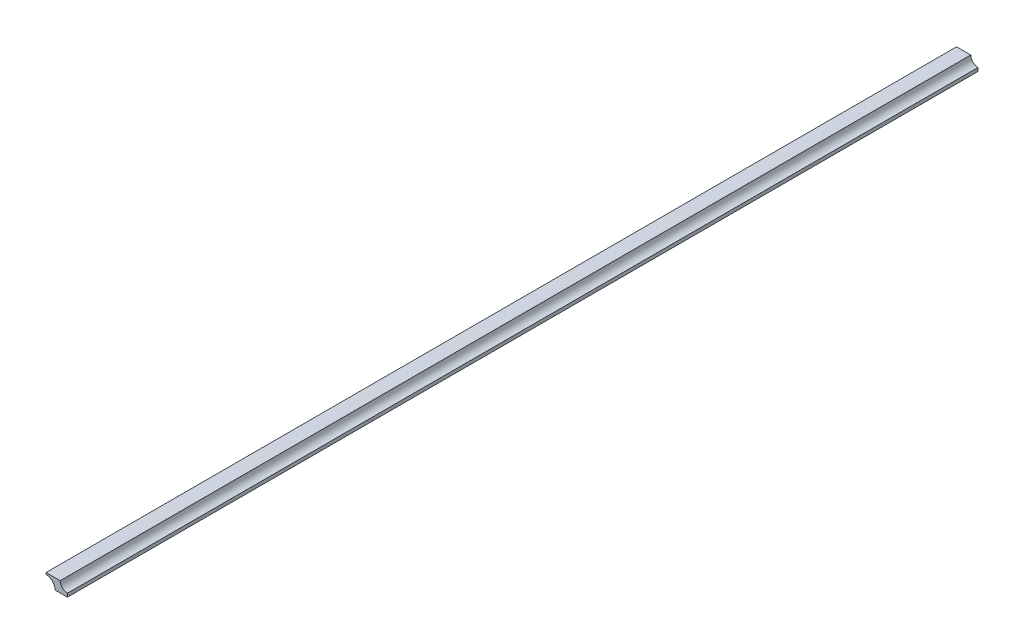
ISO-10303-21;
HEADER;
FILE_DESCRIPTION(('STEP AP214'),'2;1');
FILE_NAME('part.step','',(''),(''),'','','');
FILE_SCHEMA(('AUTOMOTIVE_DESIGN { 1 0 10303 214 1 1 1 1 }'));
ENDSEC;
DATA;
#1=APPLICATION_CONTEXT('core data for automotive mechanical design processes');
#2=APPLICATION_PROTOCOL_DEFINITION('international standard','automotive_design',2000,#1);
#3=PRODUCT_CONTEXT('',#1,'mechanical');
#4=PRODUCT('Part','Part','',(#3));
#5=PRODUCT_RELATED_PRODUCT_CATEGORY('part','',(#4));
#6=PRODUCT_DEFINITION_FORMATION('','',#4);
#7=PRODUCT_DEFINITION_CONTEXT('part definition',#1,'design');
#8=PRODUCT_DEFINITION('design','',#6,#7);
#9=PRODUCT_DEFINITION_SHAPE('','',#8);
#10=(LENGTH_UNIT() NAMED_UNIT(*) SI_UNIT(.MILLI.,.METRE.));
#11=(NAMED_UNIT(*) PLANE_ANGLE_UNIT() SI_UNIT($,.RADIAN.));
#12=(NAMED_UNIT(*) SI_UNIT($,.STERADIAN.) SOLID_ANGLE_UNIT());
#13=UNCERTAINTY_MEASURE_WITH_UNIT(LENGTH_MEASURE(1.E-05),#10,'distance_accuracy_value','');
#14=(GEOMETRIC_REPRESENTATION_CONTEXT(3) GLOBAL_UNCERTAINTY_ASSIGNED_CONTEXT((#13)) GLOBAL_UNIT_ASSIGNED_CONTEXT((#10,
#11,#12)) REPRESENTATION_CONTEXT('',''));
#15=CARTESIAN_POINT('',(0.,0.,0.));
#16=DIRECTION('',(0.,0.,1.));
#17=DIRECTION('',(1.,0.,0.));
#18=AXIS2_PLACEMENT_3D('',#15,#16,#17);
#19=CARTESIAN_POINT('',(0.,9.4,800.));
#20=DIRECTION('',(0.,-1.,0.));
#21=DIRECTION('',(0.,0.,-1.));
#22=AXIS2_PLACEMENT_3D('',#19,#20,#21);
#23=PLANE('',#22);
#24=DIRECTION('',(-1.,0.,0.));
#25=VECTOR('',#24,1.);
#26=CARTESIAN_POINT('',(0.,9.4,0.));
#27=LINE('',#26,#25);
#28=CARTESIAN_POINT('',(12.45,9.4,0.));
#29=VERTEX_POINT('',#28);
#30=CARTESIAN_POINT('',(0.,9.4,0.));
#31=VERTEX_POINT('',#30);
#32=EDGE_CURVE('E134',#29,#31,#27,.T.);
#33=ORIENTED_EDGE('',*,*,#32,.T.);
#34=DIRECTION('',(0.,0.,-1.));
#35=VECTOR('',#34,1.);
#36=CARTESIAN_POINT('',(0.,9.4,800.));
#37=LINE('',#36,#35);
#38=CARTESIAN_POINT('',(0.,9.4,800.));
#39=VERTEX_POINT('',#38);
#40=EDGE_CURVE('E11',#39,#31,#37,.T.);
#41=ORIENTED_EDGE('',*,*,#40,.F.);
#42=DIRECTION('',(-1.,0.,0.));
#43=VECTOR('',#42,1.);
#44=CARTESIAN_POINT('',(0.,9.4,800.));
#45=LINE('',#44,#43);
#46=CARTESIAN_POINT('',(12.45,9.4,800.));
#47=VERTEX_POINT('',#46);
#48=EDGE_CURVE('E150',#47,#39,#45,.T.);
#49=ORIENTED_EDGE('',*,*,#48,.F.);
#50=DIRECTION('',(0.,0.,-1.));
#51=VECTOR('',#50,1.);
#52=CARTESIAN_POINT('',(12.45,9.4,800.));
#53=LINE('',#52,#51);
#54=EDGE_CURVE('E130',#47,#29,#53,.T.);
#55=ORIENTED_EDGE('',*,*,#54,.T.);
#56=EDGE_LOOP('',(#33,#41,#49,#55));
#57=FACE_BOUND('',#56,.T.);
#58=ADVANCED_FACE('F45',(#57),#23,.F.);
#59=CARTESIAN_POINT('',(0.,7.94,800.));
#60=DIRECTION('',(1.,0.,0.));
#61=DIRECTION('',(0.,0.,-1.));
#62=AXIS2_PLACEMENT_3D('',#59,#60,#61);
#63=PLANE('',#62);
#64=DIRECTION('',(0.,-1.,0.));
#65=VECTOR('',#64,1.);
#66=CARTESIAN_POINT('',(0.,7.94,0.));
#67=LINE('',#66,#65);
#68=CARTESIAN_POINT('',(0.,7.94,0.));
#69=VERTEX_POINT('',#68);
#70=EDGE_CURVE('E138',#31,#69,#67,.T.);
#71=ORIENTED_EDGE('',*,*,#70,.T.);
#72=DIRECTION('',(0.,0.,-1.));
#73=VECTOR('',#72,1.);
#74=CARTESIAN_POINT('',(0.,7.94,800.));
#75=LINE('',#74,#73);
#76=CARTESIAN_POINT('',(0.,7.94,800.));
#77=VERTEX_POINT('',#76);
#78=EDGE_CURVE('E54',#77,#69,#75,.T.);
#79=ORIENTED_EDGE('',*,*,#78,.F.);
#80=DIRECTION('',(0.,-1.,0.));
#81=VECTOR('',#80,1.);
#82=CARTESIAN_POINT('',(0.,7.94,800.));
#83=LINE('',#82,#81);
#84=EDGE_CURVE('E99',#39,#77,#83,.T.);
#85=ORIENTED_EDGE('',*,*,#84,.F.);
#86=ORIENTED_EDGE('',*,*,#40,.T.);
#87=EDGE_LOOP('',(#71,#79,#85,#86));
#88=FACE_BOUND('',#87,.T.);
#89=ADVANCED_FACE('F178',(#88),#63,.F.);
#90=CARTESIAN_POINT('',(0.,0.,800.));
#91=DIRECTION('',(0.,0.,-1.));
#92=DIRECTION('',(-1.,0.,0.));
#93=AXIS2_PLACEMENT_3D('',#90,#91,#92);
#94=CYLINDRICAL_SURFACE('',#93,7.94);
#95=CARTESIAN_POINT('',(0.,0.,0.));
#96=DIRECTION('',(0.,0.,-1.));
#97=DIRECTION('',(1.,0.,0.));
#98=AXIS2_PLACEMENT_3D('',#95,#96,#97);
#99=CIRCLE('',#98,7.94);
#100=CARTESIAN_POINT('',(7.94,0.,0.));
#101=VERTEX_POINT('',#100);
#102=EDGE_CURVE('E141',#69,#101,#99,.T.);
#103=ORIENTED_EDGE('',*,*,#102,.T.);
#104=DIRECTION('',(0.,0.,-1.));
#105=VECTOR('',#104,1.);
#106=CARTESIAN_POINT('',(7.94,0.,800.));
#107=LINE('',#106,#105);
#108=CARTESIAN_POINT('',(7.94,0.,800.));
#109=VERTEX_POINT('',#108);
#110=EDGE_CURVE('E123',#109,#101,#107,.T.);
#111=ORIENTED_EDGE('',*,*,#110,.F.);
#112=CARTESIAN_POINT('',(0.,0.,800.));
#113=DIRECTION('',(0.,0.,-1.));
#114=DIRECTION('',(1.,0.,0.));
#115=AXIS2_PLACEMENT_3D('',#112,#113,#114);
#116=CIRCLE('',#115,7.94);
#117=EDGE_CURVE('E112',#77,#109,#116,.T.);
#118=ORIENTED_EDGE('',*,*,#117,.F.);
#119=ORIENTED_EDGE('',*,*,#78,.T.);
#120=EDGE_LOOP('',(#103,#111,#118,#119));
#121=FACE_BOUND('',#120,.T.);
#122=ADVANCED_FACE('F160',(#121),#94,.F.);
#123=CARTESIAN_POINT('',(7.94,0.,800.));
#124=DIRECTION('',(0.,1.,0.));
#125=DIRECTION('',(0.,0.,1.));
#126=AXIS2_PLACEMENT_3D('',#123,#124,#125);
#127=PLANE('',#126);
#128=DIRECTION('',(1.,0.,0.));
#129=VECTOR('',#128,1.);
#130=CARTESIAN_POINT('',(7.94,0.,0.));
#131=LINE('',#130,#129);
#132=CARTESIAN_POINT('',(18.8,0.,0.));
#133=VERTEX_POINT('',#132);
#134=EDGE_CURVE('E121',#101,#133,#131,.T.);
#135=ORIENTED_EDGE('',*,*,#134,.T.);
#136=DIRECTION('',(0.,0.,-1.));
#137=VECTOR('',#136,1.);
#138=CARTESIAN_POINT('',(18.8,0.,800.));
#139=LINE('',#138,#137);
#140=CARTESIAN_POINT('',(18.8,0.,800.));
#141=VERTEX_POINT('',#140);
#142=EDGE_CURVE('E118',#141,#133,#139,.T.);
#143=ORIENTED_EDGE('',*,*,#142,.F.);
#144=DIRECTION('',(1.,0.,0.));
#145=VECTOR('',#144,1.);
#146=CARTESIAN_POINT('',(7.94,0.,800.));
#147=LINE('',#146,#145);
#148=EDGE_CURVE('E106',#109,#141,#147,.T.);
#149=ORIENTED_EDGE('',*,*,#148,.F.);
#150=ORIENTED_EDGE('',*,*,#110,.T.);
#151=EDGE_LOOP('',(#135,#143,#149,#150));
#152=FACE_BOUND('',#151,.T.);
#153=ADVANCED_FACE('F119',(#152),#127,.F.);
#154=CARTESIAN_POINT('',(18.8,0.,800.));
#155=DIRECTION('',(-1.,0.,0.));
#156=DIRECTION('',(0.,0.,1.));
#157=AXIS2_PLACEMENT_3D('',#154,#155,#156);
#158=PLANE('',#157);
#159=DIRECTION('',(0.,1.,0.));
#160=VECTOR('',#159,1.);
#161=CARTESIAN_POINT('',(18.8,0.,0.));
#162=LINE('',#161,#160);
#163=CARTESIAN_POINT('',(18.8,3.05,0.));
#164=VERTEX_POINT('',#163);
#165=EDGE_CURVE('E85',#133,#164,#162,.T.);
#166=ORIENTED_EDGE('',*,*,#165,.T.);
#167=DIRECTION('',(0.,0.,-1.));
#168=VECTOR('',#167,1.);
#169=CARTESIAN_POINT('',(18.8,3.05,800.));
#170=LINE('',#169,#168);
#171=CARTESIAN_POINT('',(18.8,3.05,800.));
#172=VERTEX_POINT('',#171);
#173=EDGE_CURVE('E124',#172,#164,#170,.T.);
#174=ORIENTED_EDGE('',*,*,#173,.F.);
#175=DIRECTION('',(0.,1.,0.));
#176=VECTOR('',#175,1.);
#177=CARTESIAN_POINT('',(18.8,0.,800.));
#178=LINE('',#177,#176);
#179=EDGE_CURVE('E110',#141,#172,#178,.T.);
#180=ORIENTED_EDGE('',*,*,#179,.F.);
#181=ORIENTED_EDGE('',*,*,#142,.T.);
#182=EDGE_LOOP('',(#166,#174,#180,#181));
#183=FACE_BOUND('',#182,.T.);
#184=ADVANCED_FACE('F126',(#183),#158,.F.);
#185=CARTESIAN_POINT('',(18.8,9.4,800.));
#186=DIRECTION('',(0.,0.,-1.));
#187=DIRECTION('',(-1.,0.,0.));
#188=AXIS2_PLACEMENT_3D('',#185,#186,#187);
#189=CYLINDRICAL_SURFACE('',#188,6.35);
#190=CARTESIAN_POINT('',(18.8,9.4,0.));
#191=DIRECTION('',(0.,0.,-1.));
#192=DIRECTION('',(1.,0.,0.));
#193=AXIS2_PLACEMENT_3D('',#190,#191,#192);
#194=CIRCLE('',#193,6.35);
#195=EDGE_CURVE('E91',#164,#29,#194,.T.);
#196=ORIENTED_EDGE('',*,*,#195,.T.);
#197=ORIENTED_EDGE('',*,*,#54,.F.);
#198=CARTESIAN_POINT('',(18.8,9.4,800.));
#199=DIRECTION('',(0.,0.,-1.));
#200=DIRECTION('',(1.,0.,0.));
#201=AXIS2_PLACEMENT_3D('',#198,#199,#200);
#202=CIRCLE('',#201,6.35);
#203=EDGE_CURVE('E62',#172,#47,#202,.T.);
#204=ORIENTED_EDGE('',*,*,#203,.F.);
#205=ORIENTED_EDGE('',*,*,#173,.T.);
#206=EDGE_LOOP('',(#196,#197,#204,#205));
#207=FACE_BOUND('',#206,.T.);
#208=ADVANCED_FACE('F167',(#207),#189,.F.);
#209=CARTESIAN_POINT('',(18.8,9.4,800.));
#210=DIRECTION('',(0.,0.,1.));
#211=DIRECTION('',(1.,0.,0.));
#212=AXIS2_PLACEMENT_3D('',#209,#210,#211);
#213=PLANE('',#212);
#214=ORIENTED_EDGE('',*,*,#48,.T.);
#215=ORIENTED_EDGE('',*,*,#84,.T.);
#216=ORIENTED_EDGE('',*,*,#117,.T.);
#217=ORIENTED_EDGE('',*,*,#148,.T.);
#218=ORIENTED_EDGE('',*,*,#179,.T.);
#219=ORIENTED_EDGE('',*,*,#203,.T.);
#220=EDGE_LOOP('',(#214,#215,#216,#217,#218,#219));
#221=FACE_BOUND('',#220,.T.);
#222=ADVANCED_FACE('F108',(#221),#213,.T.);
#223=CARTESIAN_POINT('',(18.8,9.4,0.));
#224=DIRECTION('',(0.,0.,1.));
#225=DIRECTION('',(1.,0.,0.));
#226=AXIS2_PLACEMENT_3D('',#223,#224,#225);
#227=PLANE('',#226);
#228=ORIENTED_EDGE('',*,*,#32,.F.);
#229=ORIENTED_EDGE('',*,*,#195,.F.);
#230=ORIENTED_EDGE('',*,*,#165,.F.);
#231=ORIENTED_EDGE('',*,*,#134,.F.);
#232=ORIENTED_EDGE('',*,*,#102,.F.);
#233=ORIENTED_EDGE('',*,*,#70,.F.);
#234=EDGE_LOOP('',(#228,#229,#230,#231,#232,#233));
#235=FACE_BOUND('',#234,.T.);
#236=ADVANCED_FACE('F163',(#235),#227,.F.);
#237=CLOSED_SHELL('',(#58,#89,#122,#153,#184,#208,#222,#236));
#238=MANIFOLD_SOLID_BREP('B2',#237);
#239=ADVANCED_BREP_SHAPE_REPRESENTATION('',(#18,#238),#14);
#240=SHAPE_DEFINITION_REPRESENTATION(#9,#239);
ENDSEC;
END-ISO-10303-21;
